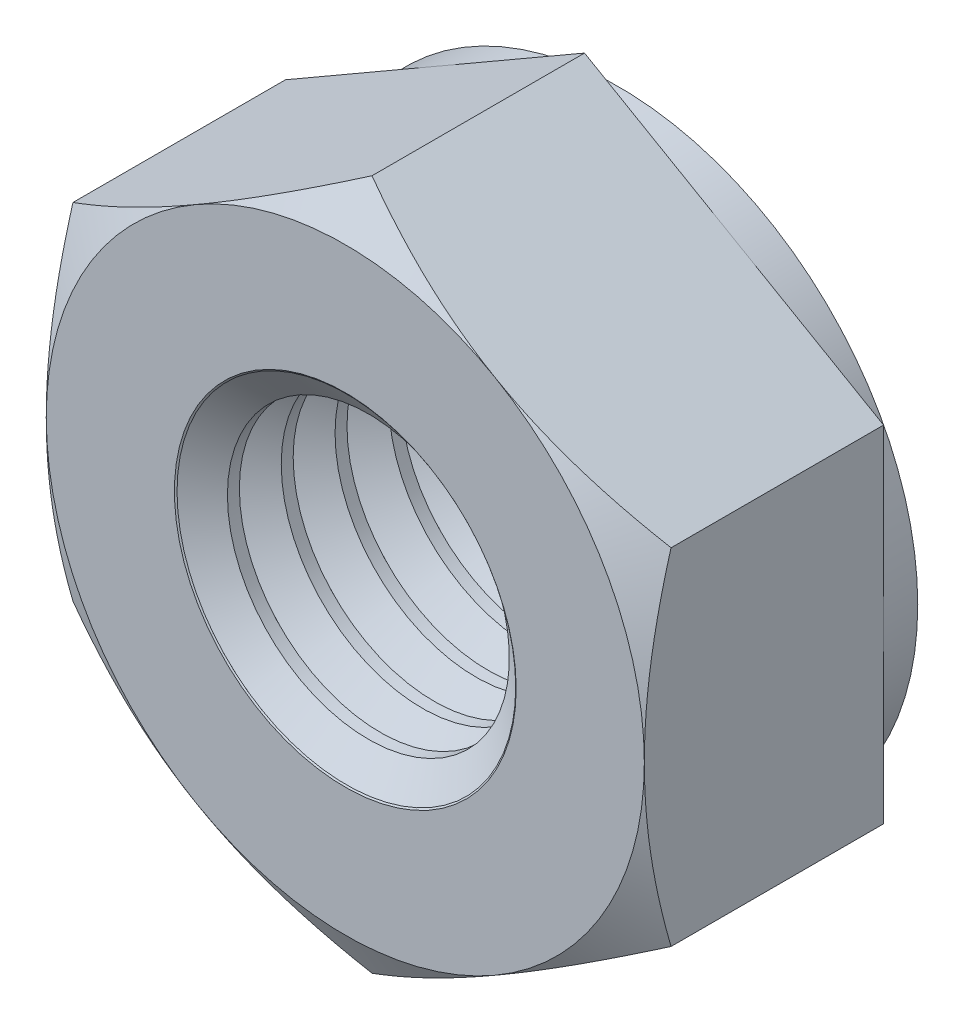
ISO-10303-21;
HEADER;
FILE_DESCRIPTION(('STEP AP214'),'2;1');
FILE_NAME('part.step','',(''),(''),'','','');
FILE_SCHEMA(('AUTOMOTIVE_DESIGN { 1 0 10303 214 1 1 1 1 }'));
ENDSEC;
DATA;
#1=APPLICATION_CONTEXT('core data for automotive mechanical design processes');
#2=APPLICATION_PROTOCOL_DEFINITION('international standard','automotive_design',2000,#1);
#3=PRODUCT_CONTEXT('',#1,'mechanical');
#4=PRODUCT('Part','Part','',(#3));
#5=PRODUCT_RELATED_PRODUCT_CATEGORY('part','',(#4));
#6=PRODUCT_DEFINITION_FORMATION('','',#4);
#7=PRODUCT_DEFINITION_CONTEXT('part definition',#1,'design');
#8=PRODUCT_DEFINITION('design','',#6,#7);
#9=PRODUCT_DEFINITION_SHAPE('','',#8);
#10=(LENGTH_UNIT() NAMED_UNIT(*) SI_UNIT(.MILLI.,.METRE.));
#11=(NAMED_UNIT(*) PLANE_ANGLE_UNIT() SI_UNIT($,.RADIAN.));
#12=(NAMED_UNIT(*) SI_UNIT($,.STERADIAN.) SOLID_ANGLE_UNIT());
#13=UNCERTAINTY_MEASURE_WITH_UNIT(LENGTH_MEASURE(1.E-05),#10,'distance_accuracy_value','');
#14=(GEOMETRIC_REPRESENTATION_CONTEXT(3) GLOBAL_UNCERTAINTY_ASSIGNED_CONTEXT((#13)) GLOBAL_UNIT_ASSIGNED_CONTEXT((#10,
#11,#12)) REPRESENTATION_CONTEXT('',''));
#15=CARTESIAN_POINT('',(0.,0.,0.));
#16=DIRECTION('',(0.,0.,1.));
#17=DIRECTION('',(1.,0.,0.));
#18=AXIS2_PLACEMENT_3D('',#15,#16,#17);
#19=CARTESIAN_POINT('',(0.,0.,-3.2));
#20=DIRECTION('',(0.,0.,1.));
#21=DIRECTION('',(1.,0.,0.));
#22=AXIS2_PLACEMENT_3D('',#19,#20,#21);
#23=CYLINDRICAL_SURFACE('',#22,1.65);
#24=CARTESIAN_POINT('',(0.,0.,-2.7898326383734));
#25=DIRECTION('',(0.,0.,-1.));
#26=DIRECTION('',(-1.,0.,0.));
#27=AXIS2_PLACEMENT_3D('',#24,#25,#26);
#28=CIRCLE('',#27,1.65);
#29=CARTESIAN_POINT('',(-1.65,0.,-2.7898326383734));
#30=VERTEX_POINT('',#29);
#31=EDGE_CURVE('E631',#30,#30,#28,.T.);
#32=ORIENTED_EDGE('',*,*,#31,.F.);
#33=EDGE_LOOP('',(#32));
#34=FACE_BOUND('',#33,.T.);
#35=CARTESIAN_POINT('',(0.,0.,-2.9295273616266));
#36=DIRECTION('',(0.,0.,-1.));
#37=DIRECTION('',(-1.,0.,0.));
#38=AXIS2_PLACEMENT_3D('',#35,#36,#37);
#39=CIRCLE('',#38,1.65);
#40=CARTESIAN_POINT('',(-1.65,0.,-2.9295273616266));
#41=VERTEX_POINT('',#40);
#42=EDGE_CURVE('E273',#41,#41,#39,.F.);
#43=ORIENTED_EDGE('',*,*,#42,.F.);
#44=EDGE_LOOP('',(#43));
#45=FACE_BOUND('',#44,.T.);
#46=ADVANCED_FACE('F36',(#34,#45),#23,.F.);
#47=CARTESIAN_POINT('',(0.,0.,-2.29968736162661));
#48=DIRECTION('',(0.,0.,-1.));
#49=DIRECTION('',(-1.,0.,0.));
#50=AXIS2_PLACEMENT_3D('',#47,#48,#49);
#51=CIRCLE('',#50,1.65);
#52=CARTESIAN_POINT('',(-1.65,0.,-2.29968736162661));
#53=VERTEX_POINT('',#52);
#54=EDGE_CURVE('E632',#53,#53,#51,.T.);
#55=ORIENTED_EDGE('',*,*,#54,.T.);
#56=EDGE_LOOP('',(#55));
#57=FACE_BOUND('',#56,.T.);
#58=CARTESIAN_POINT('',(0.,0.,-2.1599926383734));
#59=DIRECTION('',(0.,0.,-1.));
#60=DIRECTION('',(-1.,0.,0.));
#61=AXIS2_PLACEMENT_3D('',#58,#59,#60);
#62=CIRCLE('',#61,1.65);
#63=CARTESIAN_POINT('',(-1.65,0.,-2.1599926383734));
#64=VERTEX_POINT('',#63);
#65=EDGE_CURVE('E641',#64,#64,#62,.T.);
#66=ORIENTED_EDGE('',*,*,#65,.F.);
#67=EDGE_LOOP('',(#66));
#68=FACE_BOUND('',#67,.T.);
#69=ADVANCED_FACE('F228',(#57,#68),#23,.F.);
#70=CARTESIAN_POINT('',(0.,0.,-1.66984736162661));
#71=DIRECTION('',(0.,0.,-1.));
#72=DIRECTION('',(-1.,0.,0.));
#73=AXIS2_PLACEMENT_3D('',#70,#71,#72);
#74=CIRCLE('',#73,1.65);
#75=CARTESIAN_POINT('',(-1.65,0.,-1.66984736162661));
#76=VERTEX_POINT('',#75);
#77=EDGE_CURVE('E634',#76,#76,#74,.T.);
#78=ORIENTED_EDGE('',*,*,#77,.T.);
#79=EDGE_LOOP('',(#78));
#80=FACE_BOUND('',#79,.T.);
#81=CARTESIAN_POINT('',(0.,0.,-1.5301526383734));
#82=DIRECTION('',(0.,0.,-1.));
#83=DIRECTION('',(-1.,0.,0.));
#84=AXIS2_PLACEMENT_3D('',#81,#82,#83);
#85=CIRCLE('',#84,1.65);
#86=CARTESIAN_POINT('',(-1.65,0.,-1.5301526383734));
#87=VERTEX_POINT('',#86);
#88=EDGE_CURVE('E650',#87,#87,#85,.T.);
#89=ORIENTED_EDGE('',*,*,#88,.F.);
#90=EDGE_LOOP('',(#89));
#91=FACE_BOUND('',#90,.T.);
#92=ADVANCED_FACE('F235',(#80,#91),#23,.F.);
#93=CARTESIAN_POINT('',(0.,0.,-1.04000736162661));
#94=DIRECTION('',(0.,0.,-1.));
#95=DIRECTION('',(-1.,0.,0.));
#96=AXIS2_PLACEMENT_3D('',#93,#94,#95);
#97=CIRCLE('',#96,1.65);
#98=CARTESIAN_POINT('',(-1.65,0.,-1.04000736162661));
#99=VERTEX_POINT('',#98);
#100=EDGE_CURVE('E647',#99,#99,#97,.T.);
#101=ORIENTED_EDGE('',*,*,#100,.T.);
#102=EDGE_LOOP('',(#101));
#103=FACE_BOUND('',#102,.T.);
#104=CARTESIAN_POINT('',(0.,0.,-0.900312638373402));
#105=DIRECTION('',(0.,0.,-1.));
#106=DIRECTION('',(-1.,0.,0.));
#107=AXIS2_PLACEMENT_3D('',#104,#105,#106);
#108=CIRCLE('',#107,1.65);
#109=CARTESIAN_POINT('',(-1.65,0.,-0.900312638373402));
#110=VERTEX_POINT('',#109);
#111=EDGE_CURVE('E264',#110,#110,#108,.T.);
#112=ORIENTED_EDGE('',*,*,#111,.F.);
#113=EDGE_LOOP('',(#112));
#114=FACE_BOUND('',#113,.T.);
#115=ADVANCED_FACE('F241',(#103,#114),#23,.F.);
#116=CARTESIAN_POINT('',(0.,0.,-0.410167361626607));
#117=DIRECTION('',(0.,0.,-1.));
#118=DIRECTION('',(-1.,0.,0.));
#119=AXIS2_PLACEMENT_3D('',#116,#117,#118);
#120=CIRCLE('',#119,1.65);
#121=CARTESIAN_POINT('',(-1.65,0.,-0.410167361626607));
#122=VERTEX_POINT('',#121);
#123=EDGE_CURVE('E253',#122,#122,#120,.T.);
#124=ORIENTED_EDGE('',*,*,#123,.T.);
#125=EDGE_LOOP('',(#124));
#126=FACE_BOUND('',#125,.T.);
#127=CARTESIAN_POINT('',(0.,0.,-0.270472638373401));
#128=DIRECTION('',(0.,0.,-1.));
#129=DIRECTION('',(-1.,0.,0.));
#130=AXIS2_PLACEMENT_3D('',#127,#128,#129);
#131=CIRCLE('',#130,1.65);
#132=CARTESIAN_POINT('',(-1.65,0.,-0.270472638373401));
#133=VERTEX_POINT('',#132);
#134=EDGE_CURVE('E256',#133,#133,#131,.T.);
#135=ORIENTED_EDGE('',*,*,#134,.F.);
#136=EDGE_LOOP('',(#135));
#137=FACE_BOUND('',#136,.T.);
#138=ADVANCED_FACE('F231',(#126,#137),#23,.F.);
#139=CARTESIAN_POINT('',(0.,4.04145188432738,-3.2));
#140=DIRECTION('',(-0.5,0.866025403784438,0.));
#141=DIRECTION('',(-0.866025403784438,-0.5,0.));
#142=AXIS2_PLACEMENT_3D('',#139,#140,#141);
#143=PLANE('',#142);
#144=DIRECTION('',(0.,0.,1.));
#145=VECTOR('',#144,1.);
#146=CARTESIAN_POINT('',(-3.5,2.02072594216369,-3.2));
#147=LINE('',#146,#145);
#148=CARTESIAN_POINT('',(-3.5,2.02072594216369,-2.8));
#149=VERTEX_POINT('',#148);
#150=CARTESIAN_POINT('',(-3.5,2.02072594216369,-0.312607391169644));
#151=VERTEX_POINT('',#150);
#152=EDGE_CURVE('E290',#149,#151,#147,.T.);
#153=ORIENTED_EDGE('',*,*,#152,.T.);
#154=CARTESIAN_POINT('',(-3.5002,2.02061047210985,-0.312674060693372));
#155=CARTESIAN_POINT('',(-3.34639282154755,2.10941108799267,-0.261385788989984));
#156=CARTESIAN_POINT('',(-3.19125798916558,2.19897822522909,-0.214740953816197));
#157=CARTESIAN_POINT('',(-2.87830199342322,2.37966345361545,-0.133321875533348));
#158=CARTESIAN_POINT('',(-2.7204752692125,2.47078475532382,-0.0985764355845612));
#159=CARTESIAN_POINT('',(-2.40677778961987,2.65189807961073,-0.0444900271828358));
#160=CARTESIAN_POINT('',(-2.25095530083931,2.74186223545399,-0.0247890862603812));
#161=CARTESIAN_POINT('',(-1.93857711279463,2.92221386641056,-0.0012701327372539));
#162=CARTESIAN_POINT('',(-1.78202254896577,3.01260068598001,0.00256735545443528));
#163=CARTESIAN_POINT('',(-1.48949078007901,3.1814939814933,-0.00541530187697733));
#164=CARTESIAN_POINT('',(-1.35346978754209,3.26002573814993,-0.0152754340696069));
#165=CARTESIAN_POINT('',(-1.082313979711,3.41657761679354,-0.0465264668994037));
#166=CARTESIAN_POINT('',(-0.947180102315317,3.49459719728458,-0.0679280432857986));
#167=CARTESIAN_POINT('',(-0.675465207594816,3.65147186489429,-0.121430407880578));
#168=CARTESIAN_POINT('',(-0.538918580721664,3.73030709667644,-0.153757994445087));
#169=CARTESIAN_POINT('',(-0.267861907055498,3.88680174018324,-0.227128933807995));
#170=CARTESIAN_POINT('',(-0.133348387531463,3.96446315689009,-0.268155046569868));
#171=CARTESIAN_POINT('',(0.000200000000000051,4.04156735438122,-0.312674060693372));
#172=B_SPLINE_CURVE_WITH_KNOTS('',3,(#154,#155,#156,#157,#158,#159,#160,#161,#162,#163,#164,
#165,#166,#167,#168,#169,#170,#171),.UNSPECIFIED.,.F.,.F.,(4,2,2,2,2,2,2,2,4),(0.,
0.554793832886254,1.11092123814984,1.65328467083219,2.19498204478403,2.6666513085086,
3.13875761298267,3.6213361260051,4.10296698719187),.UNSPECIFIED.);
#173=CARTESIAN_POINT('',(-1.75,3.03108891324554,0.));
#174=VERTEX_POINT('',#173);
#175=EDGE_CURVE('E139',#151,#174,#172,.T.);
#176=ORIENTED_EDGE('',*,*,#175,.T.);
#177=CARTESIAN_POINT('',(0.,4.04145188432738,-0.312607391169644));
#178=VERTEX_POINT('',#177);
#179=EDGE_CURVE('E166',#174,#178,#172,.T.);
#180=ORIENTED_EDGE('',*,*,#179,.T.);
#181=DIRECTION('',(0.,0.,1.));
#182=VECTOR('',#181,1.);
#183=CARTESIAN_POINT('',(0.,4.04145188432738,-3.2));
#184=LINE('',#183,#182);
#185=CARTESIAN_POINT('',(0.,4.04145188432738,-2.8));
#186=VERTEX_POINT('',#185);
#187=EDGE_CURVE('E289',#186,#178,#184,.T.);
#188=ORIENTED_EDGE('',*,*,#187,.F.);
#189=DIRECTION('',(-0.866025403784438,-0.5,0.));
#190=VECTOR('',#189,1.);
#191=CARTESIAN_POINT('',(0.,4.04145188432738,-2.8));
#192=LINE('',#191,#190);
#193=CARTESIAN_POINT('',(-1.75,3.03108891324554,-2.8));
#194=VERTEX_POINT('',#193);
#195=EDGE_CURVE('E318',#186,#194,#192,.T.);
#196=ORIENTED_EDGE('',*,*,#195,.T.);
#197=EDGE_CURVE('E315',#194,#149,#192,.T.);
#198=ORIENTED_EDGE('',*,*,#197,.T.);
#199=EDGE_LOOP('',(#153,#176,#180,#188,#196,#198));
#200=FACE_BOUND('',#199,.T.);
#201=ADVANCED_FACE('F38',(#200),#143,.T.);
#202=CARTESIAN_POINT('',(3.5,2.02072594216369,-3.2));
#203=DIRECTION('',(0.5,0.866025403784438,0.));
#204=DIRECTION('',(-0.866025403784438,0.5,0.));
#205=AXIS2_PLACEMENT_3D('',#202,#203,#204);
#206=PLANE('',#205);
#207=ORIENTED_EDGE('',*,*,#187,.T.);
#208=CARTESIAN_POINT('',(-0.000199999999999658,4.04156735438122,-0.312674060693372));
#209=CARTESIAN_POINT('',(0.15360717845245,3.9527667384984,-0.261385788989984));
#210=CARTESIAN_POINT('',(0.308742010834424,3.86319960126198,-0.214740953816198));
#211=CARTESIAN_POINT('',(0.621698006576782,3.68251437287562,-0.133321875533349));
#212=CARTESIAN_POINT('',(0.779524730787497,3.59139307116725,-0.0985764355845616));
#213=CARTESIAN_POINT('',(1.09322221038013,3.41027974688034,-0.0444900271828358));
#214=CARTESIAN_POINT('',(1.24904469916069,3.32031559103708,-0.0247890862603809));
#215=CARTESIAN_POINT('',(1.56142288720538,3.13996396008051,-0.00127013273725367));
#216=CARTESIAN_POINT('',(1.71797745103423,3.04957714051106,0.00256735545443519));
#217=CARTESIAN_POINT('',(2.01050921992099,2.88068384499777,-0.00541530187697748));
#218=CARTESIAN_POINT('',(2.14653021245791,2.80215208834114,-0.0152754340696069));
#219=CARTESIAN_POINT('',(2.417686020289,2.64560020969753,-0.0465264668994032));
#220=CARTESIAN_POINT('',(2.55281989768468,2.56758062920649,-0.0679280432857978));
#221=CARTESIAN_POINT('',(2.82453479240518,2.41070596159678,-0.121430407880577));
#222=CARTESIAN_POINT('',(2.96108141927834,2.33187072981463,-0.153757994445087));
#223=CARTESIAN_POINT('',(3.2321380929445,2.17537608630783,-0.227128933807994));
#224=CARTESIAN_POINT('',(3.36665161246854,2.09771466960098,-0.268155046569867));
#225=CARTESIAN_POINT('',(3.5002,2.02061047210985,-0.312674060693371));
#226=B_SPLINE_CURVE_WITH_KNOTS('',3,(#208,#209,#210,#211,#212,#213,#214,#215,#216,#217,#218,
#219,#220,#221,#222,#223,#224,#225),.UNSPECIFIED.,.F.,.F.,(4,2,2,2,2,2,2,2,4),(0.,
0.554793832886254,1.11092123814984,1.65328467083219,2.19498204478403,2.6666513085086,
3.13875761298267,3.6213361260051,4.10296698719187),.UNSPECIFIED.);
#227=CARTESIAN_POINT('',(1.75,3.03108891324553,0.));
#228=VERTEX_POINT('',#227);
#229=EDGE_CURVE('E162',#178,#228,#226,.T.);
#230=ORIENTED_EDGE('',*,*,#229,.T.);
#231=CARTESIAN_POINT('',(3.5,2.02072594216369,-0.312607391169644));
#232=VERTEX_POINT('',#231);
#233=EDGE_CURVE('E148',#228,#232,#226,.T.);
#234=ORIENTED_EDGE('',*,*,#233,.T.);
#235=DIRECTION('',(0.,0.,1.));
#236=VECTOR('',#235,1.);
#237=CARTESIAN_POINT('',(3.5,2.02072594216369,-3.2));
#238=LINE('',#237,#236);
#239=CARTESIAN_POINT('',(3.5,2.02072594216369,-2.8));
#240=VERTEX_POINT('',#239);
#241=EDGE_CURVE('E161',#240,#232,#238,.T.);
#242=ORIENTED_EDGE('',*,*,#241,.F.);
#243=DIRECTION('',(-0.866025403784438,0.5,0.));
#244=VECTOR('',#243,1.);
#245=CARTESIAN_POINT('',(3.5,2.02072594216369,-2.8));
#246=LINE('',#245,#244);
#247=CARTESIAN_POINT('',(1.75,3.03108891324553,-2.8));
#248=VERTEX_POINT('',#247);
#249=EDGE_CURVE('E310',#240,#248,#246,.T.);
#250=ORIENTED_EDGE('',*,*,#249,.T.);
#251=EDGE_CURVE('E307',#248,#186,#246,.T.);
#252=ORIENTED_EDGE('',*,*,#251,.T.);
#253=EDGE_LOOP('',(#207,#230,#234,#242,#250,#252));
#254=FACE_BOUND('',#253,.T.);
#255=ADVANCED_FACE('F247',(#254),#206,.T.);
#256=CARTESIAN_POINT('',(3.5,2.02072594216369,-3.2));
#257=DIRECTION('',(-1.,0.,0.));
#258=DIRECTION('',(0.,0.,1.));
#259=AXIS2_PLACEMENT_3D('',#256,#257,#258);
#260=PLANE('',#259);
#261=CARTESIAN_POINT('',(3.5,-5.35926299121405,-1.67484346858556));
#262=CARTESIAN_POINT('',(3.5,-5.20559319908842,-1.60058173692104));
#263=CARTESIAN_POINT('',(3.5,-5.05156008083375,-1.52705822833147));
#264=CARTESIAN_POINT('',(3.5,-4.7425707418071,-1.38190950344752));
#265=CARTESIAN_POINT('',(3.5,-4.58761436682436,-1.31028461582133));
#266=CARTESIAN_POINT('',(3.5,-4.27574500225542,-1.16897765517624));
#267=CARTESIAN_POINT('',(3.5,-4.11882589028192,-1.09930904568016));
#268=CARTESIAN_POINT('',(3.5,-3.80369792903855,-0.962964262242759));
#269=CARTESIAN_POINT('',(3.5,-3.64548914750595,-0.896287932319517));
#270=CARTESIAN_POINT('',(3.5,-3.32556618401855,-0.765931819095066));
#271=CARTESIAN_POINT('',(3.5,-3.16383281219923,-0.702298873688864));
#272=CARTESIAN_POINT('',(3.5,-2.83845840945597,-0.580016702089492));
#273=CARTESIAN_POINT('',(3.5,-2.67481716858826,-0.52136803037069));
#274=CARTESIAN_POINT('',(3.5,-2.34570278472049,-0.410630279877021));
#275=CARTESIAN_POINT('',(3.5,-2.18023438248742,-0.358527255435857));
#276=CARTESIAN_POINT('',(3.5,-1.84694522806369,-0.262572936976443));
#277=CARTESIAN_POINT('',(3.5,-1.6791252378753,-0.218719033467157));
#278=CARTESIAN_POINT('',(3.5,-1.34101828610925,-0.141391945584786));
#279=CARTESIAN_POINT('',(3.5,-1.17073068027693,-0.107921525211972));
#280=CARTESIAN_POINT('',(3.5,-0.828102385138483,-0.0536149564320502));
#281=CARTESIAN_POINT('',(3.5,-0.6557616940173,-0.0327788191952362));
#282=CARTESIAN_POINT('',(3.5,-0.311020490924448,-0.00558408650575642));
#283=CARTESIAN_POINT('',(3.5,-0.138627397207259,0.000866163165911387));
#284=CARTESIAN_POINT('',(3.5,0.206038074906536,-0.00105355807794622));
#285=CARTESIAN_POINT('',(3.5,0.37831047302318,-0.0094196819634321));
#286=CARTESIAN_POINT('',(3.5,0.672490555822328,-0.035768892786892));
#287=CARTESIAN_POINT('',(3.5,0.794722791084093,-0.0503206340384211));
#288=CARTESIAN_POINT('',(3.5,1.0382430543056,-0.0859367340533555));
#289=CARTESIAN_POINT('',(3.5,1.15953093025887,-0.107002119926141));
#290=CARTESIAN_POINT('',(3.5,1.52187914771348,-0.178863187081453));
#291=CARTESIAN_POINT('',(3.5,1.76124104212632,-0.23830527562201));
#292=CARTESIAN_POINT('',(3.5,2.11940971387708,-0.340826814402554));
#293=CARTESIAN_POINT('',(3.5,2.24008344316346,-0.377749699085183));
#294=CARTESIAN_POINT('',(3.5,2.48017139213728,-0.455249007699294));
#295=CARTESIAN_POINT('',(3.5,2.59958641795613,-0.49582291166355));
#296=CARTESIAN_POINT('',(3.5,2.83665760451798,-0.579779986782752));
#297=CARTESIAN_POINT('',(3.5,2.95431988203483,-0.623146060034314));
#298=CARTESIAN_POINT('',(3.5,3.188731535088,-0.712423559566866));
#299=CARTESIAN_POINT('',(3.5,3.30548051959464,-0.75833601459295));
#300=CARTESIAN_POINT('',(3.5,3.42180736613349,-0.80527038072407));
#301=B_SPLINE_CURVE_WITH_KNOTS('',3,(#261,#262,#263,#264,#265,#266,#267,#268,#269,#270,#271,
#272,#273,#274,#275,#276,#277,#278,#279,#280,#281,#282,#283,#284,#285,#286,#287,#288,#289,#290,
#291,#292,#293,#294,#295,#296,#297,#298,#299,#300),.UNSPECIFIED.,.F.,.F.,(4,2,2,2,2,2,2,2,2,2,2,
2,2,2,2,2,2,2,2,4),(0.,0.512025318465737,1.02413870177436,1.53918270315241,2.05419982499224,
2.57553975872798,3.09693761309353,3.617205066104,4.13730766217537,4.65754858684364,
5.17778997146961,5.69470725122282,6.211490334524,6.58059623222331,6.94976036239484,
7.68863804939851,8.06719621660478,8.4454950747676,8.82166461280099,9.1979872473341),.UNSPECIFIED.);
#302=CARTESIAN_POINT('',(3.5,-2.02072594216369,-0.312607391169644));
#303=VERTEX_POINT('',#302);
#304=CARTESIAN_POINT('',(3.5,0.,0.));
#305=VERTEX_POINT('',#304);
#306=EDGE_CURVE('E128',#303,#305,#301,.T.);
#307=ORIENTED_EDGE('',*,*,#306,.F.);
#308=DIRECTION('',(0.,0.,1.));
#309=VECTOR('',#308,1.);
#310=CARTESIAN_POINT('',(3.5,-2.02072594216369,-3.2));
#311=LINE('',#310,#309);
#312=CARTESIAN_POINT('',(3.5,-2.02072594216369,-2.8));
#313=VERTEX_POINT('',#312);
#314=EDGE_CURVE('E299',#313,#303,#311,.T.);
#315=ORIENTED_EDGE('',*,*,#314,.F.);
#316=DIRECTION('',(0.,-1.,0.));
#317=VECTOR('',#316,1.);
#318=CARTESIAN_POINT('',(3.5,2.02072594216369,-2.8));
#319=LINE('',#318,#317);
#320=CARTESIAN_POINT('',(3.5,0.,-2.8));
#321=VERTEX_POINT('',#320);
#322=EDGE_CURVE('E304',#321,#313,#319,.T.);
#323=ORIENTED_EDGE('',*,*,#322,.F.);
#324=EDGE_CURVE('E294',#240,#321,#319,.T.);
#325=ORIENTED_EDGE('',*,*,#324,.F.);
#326=ORIENTED_EDGE('',*,*,#241,.T.);
#327=EDGE_CURVE('E141',#305,#232,#301,.T.);
#328=ORIENTED_EDGE('',*,*,#327,.F.);
#329=EDGE_LOOP('',(#307,#315,#323,#325,#326,#328));
#330=FACE_BOUND('',#329,.T.);
#331=ADVANCED_FACE('F158',(#330),#260,.F.);
#332=CARTESIAN_POINT('',(0.,-4.04145188432739,-3.2));
#333=DIRECTION('',(0.5,-0.866025403784438,0.));
#334=DIRECTION('',(0.866025403784438,0.5,0.));
#335=AXIS2_PLACEMENT_3D('',#332,#333,#334);
#336=PLANE('',#335);
#337=ORIENTED_EDGE('',*,*,#314,.T.);
#338=CARTESIAN_POINT('',(3.5002,-2.02061047210986,-0.312674060693373));
#339=CARTESIAN_POINT('',(3.34639282154755,-2.10941108799267,-0.261385788989985));
#340=CARTESIAN_POINT('',(3.19125798916558,-2.19897822522909,-0.214740953816198));
#341=CARTESIAN_POINT('',(2.87830199342322,-2.37966345361545,-0.13332187553335));
#342=CARTESIAN_POINT('',(2.7204752692125,-2.47078475532382,-0.0985764355845621));
#343=CARTESIAN_POINT('',(2.40677778961987,-2.65189807961074,-0.0444900271828368));
#344=CARTESIAN_POINT('',(2.25095530083931,-2.741862235454,-0.0247890862603824));
#345=CARTESIAN_POINT('',(1.93857711279462,-2.92221386641056,-0.00127013273725543));
#346=CARTESIAN_POINT('',(1.78202254896577,-3.01260068598001,0.00256735545443363));
#347=CARTESIAN_POINT('',(1.48949078007901,-3.1814939814933,-0.00541530187697916));
#348=CARTESIAN_POINT('',(1.35346978754209,-3.26002573814993,-0.0152754340696088));
#349=CARTESIAN_POINT('',(1.082313979711,-3.41657761679354,-0.0465264668994056));
#350=CARTESIAN_POINT('',(0.947180102315316,-3.49459719728458,-0.0679280432858005));
#351=CARTESIAN_POINT('',(0.675465207594815,-3.65147186489429,-0.12143040788058));
#352=CARTESIAN_POINT('',(0.538918580721664,-3.73030709667644,-0.15375799444509));
#353=CARTESIAN_POINT('',(0.267861907055498,-3.88680174018325,-0.227128933807997));
#354=CARTESIAN_POINT('',(0.133348387531463,-3.96446315689009,-0.26815504656987));
#355=CARTESIAN_POINT('',(-0.000200000000000231,-4.04156735438122,-0.312674060693374));
#356=B_SPLINE_CURVE_WITH_KNOTS('',3,(#338,#339,#340,#341,#342,#343,#344,#345,#346,#347,#348,
#349,#350,#351,#352,#353,#354,#355),.UNSPECIFIED.,.F.,.F.,(4,2,2,2,2,2,2,2,4),(0.,
0.554793832886255,1.11092123814984,1.65328467083219,2.19498204478403,2.6666513085086,
3.13875761298267,3.6213361260051,4.10296698719187),.UNSPECIFIED.);
#357=CARTESIAN_POINT('',(1.75,-3.03108891324553,0.));
#358=VERTEX_POINT('',#357);
#359=EDGE_CURVE('E134',#303,#358,#356,.T.);
#360=ORIENTED_EDGE('',*,*,#359,.T.);
#361=CARTESIAN_POINT('',(0.,-4.04145188432738,-0.312607391169644));
#362=VERTEX_POINT('',#361);
#363=EDGE_CURVE('E55',#358,#362,#356,.T.);
#364=ORIENTED_EDGE('',*,*,#363,.T.);
#365=DIRECTION('',(0.,0.,1.));
#366=VECTOR('',#365,1.);
#367=CARTESIAN_POINT('',(0.,-4.04145188432739,-3.2));
#368=LINE('',#367,#366);
#369=CARTESIAN_POINT('',(0.,-4.04145188432739,-2.8));
#370=VERTEX_POINT('',#369);
#371=EDGE_CURVE('E296',#370,#362,#368,.T.);
#372=ORIENTED_EDGE('',*,*,#371,.F.);
#373=DIRECTION('',(0.866025403784438,0.5,0.));
#374=VECTOR('',#373,1.);
#375=CARTESIAN_POINT('',(0.,-4.04145188432739,-2.8));
#376=LINE('',#375,#374);
#377=CARTESIAN_POINT('',(1.75,-3.03108891324554,-2.8));
#378=VERTEX_POINT('',#377);
#379=EDGE_CURVE('E311',#370,#378,#376,.T.);
#380=ORIENTED_EDGE('',*,*,#379,.T.);
#381=EDGE_CURVE('E306',#378,#313,#376,.T.);
#382=ORIENTED_EDGE('',*,*,#381,.T.);
#383=EDGE_LOOP('',(#337,#360,#364,#372,#380,#382));
#384=FACE_BOUND('',#383,.T.);
#385=ADVANCED_FACE('F214',(#384),#336,.T.);
#386=CARTESIAN_POINT('',(-3.5,-2.02072594216369,-3.2));
#387=DIRECTION('',(-0.500000000000001,-0.866025403784438,0.));
#388=DIRECTION('',(0.866025403784438,-0.500000000000001,0.));
#389=AXIS2_PLACEMENT_3D('',#386,#387,#388);
#390=PLANE('',#389);
#391=ORIENTED_EDGE('',*,*,#371,.T.);
#392=CARTESIAN_POINT('',(0.000199999999999979,-4.04156735438122,-0.312674060693374));
#393=CARTESIAN_POINT('',(-0.15360717845245,-3.9527667384984,-0.261385788989986));
#394=CARTESIAN_POINT('',(-0.308742010834424,-3.86319960126198,-0.2147409538162));
#395=CARTESIAN_POINT('',(-0.621698006576782,-3.68251437287563,-0.133321875533351));
#396=CARTESIAN_POINT('',(-0.779524730787497,-3.59139307116725,-0.0985764355845635));
#397=CARTESIAN_POINT('',(-1.09322221038013,-3.41027974688034,-0.0444900271828377));
#398=CARTESIAN_POINT('',(-1.24904469916069,-3.32031559103708,-0.0247890862603829));
#399=CARTESIAN_POINT('',(-1.56142288720538,-3.13996396008052,-0.00127013273725543));
#400=CARTESIAN_POINT('',(-1.71797745103423,-3.04957714051106,0.00256735545443375));
#401=CARTESIAN_POINT('',(-2.01050921992099,-2.88068384499777,-0.00541530187697879));
#402=CARTESIAN_POINT('',(-2.14653021245791,-2.80215208834115,-0.0152754340696083));
#403=CARTESIAN_POINT('',(-2.417686020289,-2.64560020969754,-0.0465264668994048));
#404=CARTESIAN_POINT('',(-2.55281989768468,-2.5675806292065,-0.0679280432857996));
#405=CARTESIAN_POINT('',(-2.82453479240519,-2.41070596159679,-0.121430407880578));
#406=CARTESIAN_POINT('',(-2.96108141927834,-2.33187072981464,-0.153757994445088));
#407=CARTESIAN_POINT('',(-3.2321380929445,-2.17537608630783,-0.227128933807995));
#408=CARTESIAN_POINT('',(-3.36665161246854,-2.09771466960098,-0.268155046569868));
#409=CARTESIAN_POINT('',(-3.5002,-2.02061047210985,-0.312674060693372));
#410=B_SPLINE_CURVE_WITH_KNOTS('',3,(#392,#393,#394,#395,#396,#397,#398,#399,#400,#401,#402,
#403,#404,#405,#406,#407,#408,#409),.UNSPECIFIED.,.F.,.F.,(4,2,2,2,2,2,2,2,4),(0.,
0.554793832886255,1.11092123814984,1.65328467083219,2.19498204478403,2.6666513085086,
3.13875761298268,3.6213361260051,4.10296698719187),.UNSPECIFIED.);
#411=CARTESIAN_POINT('',(-1.75,-3.03108891324553,0.));
#412=VERTEX_POINT('',#411);
#413=EDGE_CURVE('E208',#362,#412,#410,.T.);
#414=ORIENTED_EDGE('',*,*,#413,.T.);
#415=CARTESIAN_POINT('',(-3.5,-2.02072594216369,-0.312607391169644));
#416=VERTEX_POINT('',#415);
#417=EDGE_CURVE('E62',#412,#416,#410,.T.);
#418=ORIENTED_EDGE('',*,*,#417,.T.);
#419=DIRECTION('',(0.,0.,1.));
#420=VECTOR('',#419,1.);
#421=CARTESIAN_POINT('',(-3.5,-2.02072594216369,-3.2));
#422=LINE('',#421,#420);
#423=CARTESIAN_POINT('',(-3.5,-2.02072594216369,-2.8));
#424=VERTEX_POINT('',#423);
#425=EDGE_CURVE('E293',#424,#416,#422,.T.);
#426=ORIENTED_EDGE('',*,*,#425,.F.);
#427=DIRECTION('',(0.866025403784438,-0.500000000000001,0.));
#428=VECTOR('',#427,1.);
#429=CARTESIAN_POINT('',(-3.5,-2.02072594216369,-2.8));
#430=LINE('',#429,#428);
#431=CARTESIAN_POINT('',(-1.75,-3.03108891324554,-2.8));
#432=VERTEX_POINT('',#431);
#433=EDGE_CURVE('E319',#424,#432,#430,.T.);
#434=ORIENTED_EDGE('',*,*,#433,.T.);
#435=EDGE_CURVE('E314',#432,#370,#430,.T.);
#436=ORIENTED_EDGE('',*,*,#435,.T.);
#437=EDGE_LOOP('',(#391,#414,#418,#426,#434,#436));
#438=FACE_BOUND('',#437,.T.);
#439=ADVANCED_FACE('F210',(#438),#390,.T.);
#440=CARTESIAN_POINT('',(-3.5,2.02072594216369,-3.2));
#441=DIRECTION('',(-1.,0.,0.));
#442=DIRECTION('',(0.,0.,1.));
#443=AXIS2_PLACEMENT_3D('',#440,#441,#442);
#444=PLANE('',#443);
#445=ORIENTED_EDGE('',*,*,#425,.T.);
#446=CARTESIAN_POINT('',(-3.5,-5.35926299121405,-1.67484346858556));
#447=CARTESIAN_POINT('',(-3.5,-5.20559319908842,-1.60058173692104));
#448=CARTESIAN_POINT('',(-3.5,-5.05156008083375,-1.52705822833147));
#449=CARTESIAN_POINT('',(-3.5,-4.7425707418071,-1.38190950344752));
#450=CARTESIAN_POINT('',(-3.5,-4.58761436682436,-1.31028461582133));
#451=CARTESIAN_POINT('',(-3.5,-4.27574500225542,-1.16897765517624));
#452=CARTESIAN_POINT('',(-3.5,-4.11882589028192,-1.09930904568016));
#453=CARTESIAN_POINT('',(-3.5,-3.80369792903855,-0.96296426224276));
#454=CARTESIAN_POINT('',(-3.5,-3.64548914750595,-0.896287932319518));
#455=CARTESIAN_POINT('',(-3.5,-3.32556618401855,-0.765931819095067));
#456=CARTESIAN_POINT('',(-3.5,-3.16383281219924,-0.702298873688865));
#457=CARTESIAN_POINT('',(-3.5,-2.83845840945597,-0.580016702089492));
#458=CARTESIAN_POINT('',(-3.5,-2.67481716858826,-0.521368030370691));
#459=CARTESIAN_POINT('',(-3.5,-2.34570278472049,-0.410630279877021));
#460=CARTESIAN_POINT('',(-3.5,-2.18023438248742,-0.358527255435857));
#461=CARTESIAN_POINT('',(-3.5,-1.84694522806369,-0.262572936976443));
#462=CARTESIAN_POINT('',(-3.5,-1.6791252378753,-0.218719033467157));
#463=CARTESIAN_POINT('',(-3.5,-1.34101828610925,-0.141391945584786));
#464=CARTESIAN_POINT('',(-3.5,-1.17073068027693,-0.107921525211972));
#465=CARTESIAN_POINT('',(-3.5,-0.828102385138482,-0.05361495643205));
#466=CARTESIAN_POINT('',(-3.5,-0.6557616940173,-0.0327788191952361));
#467=CARTESIAN_POINT('',(-3.5,-0.311020490924448,-0.00558408650575648));
#468=CARTESIAN_POINT('',(-3.5,-0.138627397207258,0.000866163165911363));
#469=CARTESIAN_POINT('',(-3.5,0.206038074906536,-0.0010535580779462));
#470=CARTESIAN_POINT('',(-3.5,0.37831047302318,-0.00941968196343206));
#471=CARTESIAN_POINT('',(-3.5,0.672490555822328,-0.035768892786892));
#472=CARTESIAN_POINT('',(-3.5,0.794722791084093,-0.0503206340384212));
#473=CARTESIAN_POINT('',(-3.5,1.0382430543056,-0.0859367340533555));
#474=CARTESIAN_POINT('',(-3.5,1.15953093025887,-0.107002119926141));
#475=CARTESIAN_POINT('',(-3.5,1.52187914771348,-0.178863187081453));
#476=CARTESIAN_POINT('',(-3.5,1.76124104212632,-0.238305275622009));
#477=CARTESIAN_POINT('',(-3.5,2.11940971387708,-0.340826814402554));
#478=CARTESIAN_POINT('',(-3.5,2.24008344316346,-0.377749699085183));
#479=CARTESIAN_POINT('',(-3.5,2.48017139213728,-0.455249007699294));
#480=CARTESIAN_POINT('',(-3.5,2.59958641795613,-0.495822911663549));
#481=CARTESIAN_POINT('',(-3.5,2.83665760451798,-0.579779986782752));
#482=CARTESIAN_POINT('',(-3.5,2.95431988203483,-0.623146060034314));
#483=CARTESIAN_POINT('',(-3.5,3.188731535088,-0.712423559566866));
#484=CARTESIAN_POINT('',(-3.5,3.30548051959464,-0.75833601459295));
#485=CARTESIAN_POINT('',(-3.5,3.42180736613349,-0.805270380724071));
#486=B_SPLINE_CURVE_WITH_KNOTS('',3,(#446,#447,#448,#449,#450,#451,#452,#453,#454,#455,#456,
#457,#458,#459,#460,#461,#462,#463,#464,#465,#466,#467,#468,#469,#470,#471,#472,#473,#474,#475,
#476,#477,#478,#479,#480,#481,#482,#483,#484,#485),.UNSPECIFIED.,.F.,.F.,(4,2,2,2,2,2,2,2,2,2,2,
2,2,2,2,2,2,2,2,4),(0.,0.512025318465737,1.02413870177436,1.53918270315241,2.05419982499223,
2.57553975872798,3.09693761309353,3.617205066104,4.13730766217537,4.65754858684365,
5.17778997146961,5.69470725122282,6.21149033452401,6.58059623222331,6.94976036239485,
7.68863804939851,8.06719621660478,8.4454950747676,8.82166461280099,9.19798724733411),.UNSPECIFIED.);
#487=CARTESIAN_POINT('',(-3.5,0.,0.));
#488=VERTEX_POINT('',#487);
#489=EDGE_CURVE('E209',#416,#488,#486,.T.);
#490=ORIENTED_EDGE('',*,*,#489,.T.);
#491=EDGE_CURVE('E152',#488,#151,#486,.T.);
#492=ORIENTED_EDGE('',*,*,#491,.T.);
#493=ORIENTED_EDGE('',*,*,#152,.F.);
#494=DIRECTION('',(0.,-1.,0.));
#495=VECTOR('',#494,1.);
#496=CARTESIAN_POINT('',(-3.5,2.02072594216369,-2.8));
#497=LINE('',#496,#495);
#498=CARTESIAN_POINT('',(-3.5,0.,-2.8));
#499=VERTEX_POINT('',#498);
#500=EDGE_CURVE('E285',#149,#499,#497,.T.);
#501=ORIENTED_EDGE('',*,*,#500,.T.);
#502=EDGE_CURVE('E282',#499,#424,#497,.T.);
#503=ORIENTED_EDGE('',*,*,#502,.T.);
#504=EDGE_LOOP('',(#445,#490,#492,#493,#501,#503));
#505=FACE_BOUND('',#504,.T.);
#506=ADVANCED_FACE('F213',(#505),#444,.T.);
#507=CARTESIAN_POINT('',(-7.,0.,0.));
#508=DIRECTION('',(0.,0.,1.));
#509=DIRECTION('',(1.,0.,0.));
#510=AXIS2_PLACEMENT_3D('',#507,#508,#509);
#511=PLANE('',#510);
#512=CARTESIAN_POINT('',(0.,0.,0.));
#513=DIRECTION('',(0.,0.,1.));
#514=DIRECTION('',(1.,0.,0.));
#515=AXIS2_PLACEMENT_3D('',#512,#513,#514);
#516=CIRCLE('',#515,2.);
#517=CARTESIAN_POINT('',(2.,0.,0.));
#518=VERTEX_POINT('',#517);
#519=EDGE_CURVE('E153',#518,#518,#516,.T.);
#520=ORIENTED_EDGE('',*,*,#519,.F.);
#521=EDGE_LOOP('',(#520));
#522=FACE_BOUND('',#521,.T.);
#523=CARTESIAN_POINT('',(0.,0.,0.));
#524=DIRECTION('',(0.,0.,1.));
#525=DIRECTION('',(1.,0.,0.));
#526=AXIS2_PLACEMENT_3D('',#523,#524,#525);
#527=CIRCLE('',#526,3.5);
#528=EDGE_CURVE('E12',#305,#358,#527,.F.);
#529=ORIENTED_EDGE('',*,*,#528,.F.);
#530=CARTESIAN_POINT('',(0.,0.,0.));
#531=DIRECTION('',(0.,0.,1.));
#532=DIRECTION('',(1.,0.,0.));
#533=AXIS2_PLACEMENT_3D('',#530,#531,#532);
#534=CIRCLE('',#533,3.5);
#535=EDGE_CURVE('E145',#305,#228,#534,.T.);
#536=ORIENTED_EDGE('',*,*,#535,.T.);
#537=EDGE_CURVE('E48',#174,#228,#527,.F.);
#538=ORIENTED_EDGE('',*,*,#537,.F.);
#539=EDGE_CURVE('E374',#488,#174,#527,.F.);
#540=ORIENTED_EDGE('',*,*,#539,.F.);
#541=EDGE_CURVE('E375',#412,#488,#527,.F.);
#542=ORIENTED_EDGE('',*,*,#541,.F.);
#543=EDGE_CURVE('E46',#358,#412,#527,.F.);
#544=ORIENTED_EDGE('',*,*,#543,.F.);
#545=EDGE_LOOP('',(#529,#536,#538,#540,#542,#544));
#546=FACE_BOUND('',#545,.T.);
#547=ADVANCED_FACE('F155',(#522,#546),#511,.T.);
#548=CARTESIAN_POINT('',(-7.,0.,-3.2));
#549=DIRECTION('',(0.,0.,1.));
#550=DIRECTION('',(1.,0.,0.));
#551=AXIS2_PLACEMENT_3D('',#548,#549,#550);
#552=PLANE('',#551);
#553=CARTESIAN_POINT('',(0.,0.,-3.2));
#554=DIRECTION('',(0.,0.,1.));
#555=DIRECTION('',(1.,0.,0.));
#556=AXIS2_PLACEMENT_3D('',#553,#554,#555);
#557=CIRCLE('',#556,2.);
#558=CARTESIAN_POINT('',(2.,0.,-3.2));
#559=VERTEX_POINT('',#558);
#560=EDGE_CURVE('E271',#559,#559,#557,.F.);
#561=ORIENTED_EDGE('',*,*,#560,.F.);
#562=EDGE_LOOP('',(#561));
#563=FACE_BOUND('',#562,.T.);
#564=CARTESIAN_POINT('',(0.,0.,-3.2));
#565=DIRECTION('',(0.,0.,1.));
#566=DIRECTION('',(1.,0.,0.));
#567=AXIS2_PLACEMENT_3D('',#564,#565,#566);
#568=CIRCLE('',#567,3.5);
#569=CARTESIAN_POINT('',(3.5,0.,-3.2));
#570=VERTEX_POINT('',#569);
#571=EDGE_CURVE('E286',#570,#570,#568,.F.);
#572=ORIENTED_EDGE('',*,*,#571,.T.);
#573=EDGE_LOOP('',(#572));
#574=FACE_BOUND('',#573,.T.);
#575=ADVANCED_FACE('F223',(#563,#574),#552,.F.);
#576=CARTESIAN_POINT('',(0.,14.0414518843274,-2.8));
#577=DIRECTION('',(0.,0.,-1.));
#578=DIRECTION('',(-1.,0.,0.));
#579=AXIS2_PLACEMENT_3D('',#576,#577,#578);
#580=PLANE('',#579);
#581=ORIENTED_EDGE('',*,*,#324,.T.);
#582=CARTESIAN_POINT('',(0.,0.,-2.8));
#583=DIRECTION('',(0.,0.,1.));
#584=DIRECTION('',(1.,0.,0.));
#585=AXIS2_PLACEMENT_3D('',#582,#583,#584);
#586=CIRCLE('',#585,3.5);
#587=EDGE_CURVE('E322',#321,#248,#586,.T.);
#588=ORIENTED_EDGE('',*,*,#587,.T.);
#589=ORIENTED_EDGE('',*,*,#249,.F.);
#590=EDGE_LOOP('',(#581,#588,#589));
#591=FACE_BOUND('',#590,.T.);
#592=ADVANCED_FACE('F333',(#591),#580,.T.);
#593=ORIENTED_EDGE('',*,*,#322,.T.);
#594=ORIENTED_EDGE('',*,*,#381,.F.);
#595=EDGE_CURVE('E325',#378,#321,#586,.T.);
#596=ORIENTED_EDGE('',*,*,#595,.T.);
#597=EDGE_LOOP('',(#593,#594,#596));
#598=FACE_BOUND('',#597,.T.);
#599=ADVANCED_FACE('F338',(#598),#580,.T.);
#600=EDGE_CURVE('E324',#248,#194,#586,.T.);
#601=ORIENTED_EDGE('',*,*,#600,.T.);
#602=ORIENTED_EDGE('',*,*,#195,.F.);
#603=ORIENTED_EDGE('',*,*,#251,.F.);
#604=EDGE_LOOP('',(#601,#602,#603));
#605=FACE_BOUND('',#604,.T.);
#606=ADVANCED_FACE('F409',(#605),#580,.T.);
#607=ORIENTED_EDGE('',*,*,#435,.F.);
#608=EDGE_CURVE('E368',#432,#378,#586,.T.);
#609=ORIENTED_EDGE('',*,*,#608,.T.);
#610=ORIENTED_EDGE('',*,*,#379,.F.);
#611=EDGE_LOOP('',(#607,#609,#610));
#612=FACE_BOUND('',#611,.T.);
#613=ADVANCED_FACE('F405',(#612),#580,.T.);
#614=EDGE_CURVE('E356',#194,#499,#586,.T.);
#615=ORIENTED_EDGE('',*,*,#614,.T.);
#616=ORIENTED_EDGE('',*,*,#500,.F.);
#617=ORIENTED_EDGE('',*,*,#197,.F.);
#618=EDGE_LOOP('',(#615,#616,#617));
#619=FACE_BOUND('',#618,.T.);
#620=ADVANCED_FACE('F347',(#619),#580,.T.);
#621=CARTESIAN_POINT('',(0.,0.,0.));
#622=DIRECTION('',(0.,0.,1.));
#623=DIRECTION('',(1.,0.,0.));
#624=AXIS2_PLACEMENT_3D('',#621,#622,#623);
#625=CYLINDRICAL_SURFACE('',#624,3.5);
#626=ORIENTED_EDGE('',*,*,#571,.F.);
#627=EDGE_LOOP('',(#626));
#628=FACE_BOUND('',#627,.T.);
#629=ORIENTED_EDGE('',*,*,#600,.F.);
#630=ORIENTED_EDGE('',*,*,#587,.F.);
#631=ORIENTED_EDGE('',*,*,#595,.F.);
#632=ORIENTED_EDGE('',*,*,#608,.F.);
#633=EDGE_CURVE('E369',#499,#432,#586,.T.);
#634=ORIENTED_EDGE('',*,*,#633,.F.);
#635=ORIENTED_EDGE('',*,*,#614,.F.);
#636=EDGE_LOOP('',(#629,#630,#631,#632,#634,#635));
#637=FACE_BOUND('',#636,.T.);
#638=ADVANCED_FACE('F344',(#628,#637),#625,.T.);
#639=ORIENTED_EDGE('',*,*,#502,.F.);
#640=ORIENTED_EDGE('',*,*,#633,.T.);
#641=ORIENTED_EDGE('',*,*,#433,.F.);
#642=EDGE_LOOP('',(#639,#640,#641));
#643=FACE_BOUND('',#642,.T.);
#644=ADVANCED_FACE('F193',(#643),#580,.T.);
#645=CARTESIAN_POINT('',(0.,0.,0.));
#646=DIRECTION('',(0.,0.,-1.));
#647=DIRECTION('',(-1.,0.,0.));
#648=AXIS2_PLACEMENT_3D('',#645,#646,#647);
#649=CONICAL_SURFACE('',#648,3.5,1.0471975511966);
#650=ORIENTED_EDGE('',*,*,#535,.F.);
#651=ORIENTED_EDGE('',*,*,#327,.T.);
#652=ORIENTED_EDGE('',*,*,#233,.F.);
#653=EDGE_LOOP('',(#650,#651,#652));
#654=FACE_BOUND('',#653,.T.);
#655=ADVANCED_FACE('F146',(#654),#649,.T.);
#656=ORIENTED_EDGE('',*,*,#537,.T.);
#657=ORIENTED_EDGE('',*,*,#229,.F.);
#658=ORIENTED_EDGE('',*,*,#179,.F.);
#659=EDGE_LOOP('',(#656,#657,#658));
#660=FACE_BOUND('',#659,.T.);
#661=ADVANCED_FACE('F190',(#660),#649,.T.);
#662=ORIENTED_EDGE('',*,*,#491,.F.);
#663=ORIENTED_EDGE('',*,*,#539,.T.);
#664=ORIENTED_EDGE('',*,*,#175,.F.);
#665=EDGE_LOOP('',(#662,#663,#664));
#666=FACE_BOUND('',#665,.T.);
#667=ADVANCED_FACE('F189',(#666),#649,.T.);
#668=ORIENTED_EDGE('',*,*,#541,.T.);
#669=ORIENTED_EDGE('',*,*,#489,.F.);
#670=ORIENTED_EDGE('',*,*,#417,.F.);
#671=EDGE_LOOP('',(#668,#669,#670));
#672=FACE_BOUND('',#671,.T.);
#673=ADVANCED_FACE('F183',(#672),#649,.T.);
#674=ORIENTED_EDGE('',*,*,#543,.T.);
#675=ORIENTED_EDGE('',*,*,#413,.F.);
#676=ORIENTED_EDGE('',*,*,#363,.F.);
#677=EDGE_LOOP('',(#674,#675,#676));
#678=FACE_BOUND('',#677,.T.);
#679=ADVANCED_FACE('F188',(#678),#649,.T.);
#680=ORIENTED_EDGE('',*,*,#306,.T.);
#681=ORIENTED_EDGE('',*,*,#528,.T.);
#682=ORIENTED_EDGE('',*,*,#359,.F.);
#683=EDGE_LOOP('',(#680,#681,#682));
#684=FACE_BOUND('',#683,.T.);
#685=ADVANCED_FACE('F130',(#684),#649,.T.);
#686=CARTESIAN_POINT('',(0.,0.,-0.269579902210739));
#687=DIRECTION('',(0.,0.,1.));
#688=DIRECTION('',(1.,0.,0.));
#689=AXIS2_PLACEMENT_3D('',#686,#687,#688);
#690=CONICAL_SURFACE('',#689,1.615,0.95993108859688);
#691=CARTESIAN_POINT('',(0.,0.,-0.0127000000000003));
#692=DIRECTION('',(0.,0.,-1.));
#693=DIRECTION('',(-1.,0.,0.));
#694=AXIS2_PLACEMENT_3D('',#691,#692,#693);
#695=CIRCLE('',#694,1.98186252031437);
#696=CARTESIAN_POINT('',(-1.98186252031437,0.,-0.0127000000000003));
#697=VERTEX_POINT('',#696);
#698=EDGE_CURVE('E41',#697,#697,#695,.F.);
#699=ORIENTED_EDGE('',*,*,#698,.F.);
#700=EDGE_LOOP('',(#699));
#701=FACE_BOUND('',#700,.T.);
#702=ORIENTED_EDGE('',*,*,#519,.T.);
#703=EDGE_LOOP('',(#702));
#704=FACE_BOUND('',#703,.T.);
#705=ADVANCED_FACE('F191',(#701,#704),#690,.F.);
#706=CARTESIAN_POINT('',(0.,0.,-3.1746));
#707=DIRECTION('',(0.,0.,-1.));
#708=DIRECTION('',(-1.,0.,0.));
#709=AXIS2_PLACEMENT_3D('',#706,#707,#708);
#710=CONICAL_SURFACE('',#709,2.,0.95993108859688);
#711=CARTESIAN_POINT('',(0.,0.,-3.1746));
#712=DIRECTION('',(0.,0.,1.));
#713=DIRECTION('',(1.,0.,0.));
#714=AXIS2_PLACEMENT_3D('',#711,#712,#713);
#715=CIRCLE('',#714,2.);
#716=CARTESIAN_POINT('',(2.,0.,-3.1746));
#717=VERTEX_POINT('',#716);
#718=EDGE_CURVE('E268',#717,#717,#715,.T.);
#719=ORIENTED_EDGE('',*,*,#718,.F.);
#720=EDGE_LOOP('',(#719));
#721=FACE_BOUND('',#720,.T.);
#722=ORIENTED_EDGE('',*,*,#42,.T.);
#723=EDGE_LOOP('',(#722));
#724=FACE_BOUND('',#723,.T.);
#725=ADVANCED_FACE('F395',(#721,#724),#710,.F.);
#726=CARTESIAN_POINT('',(0.,0.,-25.0375057290932));
#727=DIRECTION('',(0.,0.,1.));
#728=DIRECTION('',(1.,0.,0.));
#729=AXIS2_PLACEMENT_3D('',#726,#727,#728);
#730=CYLINDRICAL_SURFACE('',#729,2.);
#731=ORIENTED_EDGE('',*,*,#718,.T.);
#732=EDGE_LOOP('',(#731));
#733=FACE_BOUND('',#732,.T.);
#734=ORIENTED_EDGE('',*,*,#560,.T.);
#735=EDGE_LOOP('',(#734));
#736=FACE_BOUND('',#735,.T.);
#737=ADVANCED_FACE('F476',(#733,#736),#730,.F.);
#738=CARTESIAN_POINT('',(0.,0.,-0.0254));
#739=DIRECTION('',(0.,0.,-1.));
#740=DIRECTION('',(-1.,0.,0.));
#741=AXIS2_PLACEMENT_3D('',#738,#739,#740);
#742=CONICAL_SURFACE('',#741,2.,0.959931088596891);
#743=ORIENTED_EDGE('',*,*,#698,.T.);
#744=EDGE_LOOP('',(#743));
#745=FACE_BOUND('',#744,.T.);
#746=CARTESIAN_POINT('',(0.,0.,-0.0254));
#747=DIRECTION('',(0.,0.,-1.));
#748=DIRECTION('',(-1.,0.,0.));
#749=AXIS2_PLACEMENT_3D('',#746,#747,#748);
#750=CIRCLE('',#749,2.);
#751=CARTESIAN_POINT('',(-2.,0.,-0.0254));
#752=VERTEX_POINT('',#751);
#753=EDGE_CURVE('E258',#752,#752,#750,.T.);
#754=ORIENTED_EDGE('',*,*,#753,.T.);
#755=EDGE_LOOP('',(#754));
#756=FACE_BOUND('',#755,.T.);
#757=ADVANCED_FACE('F487',(#745,#756),#742,.F.);
#758=CARTESIAN_POINT('',(0.,0.,-0.270472638373401));
#759=DIRECTION('',(0.,0.,1.));
#760=DIRECTION('',(1.,0.,0.));
#761=AXIS2_PLACEMENT_3D('',#758,#759,#760);
#762=CONICAL_SURFACE('',#761,1.65,0.959931088596875);
#763=ORIENTED_EDGE('',*,*,#753,.F.);
#764=EDGE_LOOP('',(#763));
#765=FACE_BOUND('',#764,.T.);
#766=ORIENTED_EDGE('',*,*,#134,.T.);
#767=EDGE_LOOP('',(#766));
#768=FACE_BOUND('',#767,.T.);
#769=ADVANCED_FACE('F502',(#765,#768),#762,.F.);
#770=CARTESIAN_POINT('',(0.,0.,-0.65524));
#771=DIRECTION('',(0.,0.,-1.));
#772=DIRECTION('',(-1.,0.,0.));
#773=AXIS2_PLACEMENT_3D('',#770,#771,#772);
#774=CONICAL_SURFACE('',#773,2.,0.959931088596891);
#775=ORIENTED_EDGE('',*,*,#123,.F.);
#776=EDGE_LOOP('',(#775));
#777=FACE_BOUND('',#776,.T.);
#778=CARTESIAN_POINT('',(0.,0.,-0.65524));
#779=DIRECTION('',(0.,0.,-1.));
#780=DIRECTION('',(-1.,0.,0.));
#781=AXIS2_PLACEMENT_3D('',#778,#779,#780);
#782=CIRCLE('',#781,2.);
#783=CARTESIAN_POINT('',(-2.,0.,-0.65524));
#784=VERTEX_POINT('',#783);
#785=EDGE_CURVE('E259',#784,#784,#782,.T.);
#786=ORIENTED_EDGE('',*,*,#785,.T.);
#787=EDGE_LOOP('',(#786));
#788=FACE_BOUND('',#787,.T.);
#789=ADVANCED_FACE('F512',(#777,#788),#774,.F.);
#790=CARTESIAN_POINT('',(0.,0.,-0.900312638373402));
#791=DIRECTION('',(0.,0.,1.));
#792=DIRECTION('',(1.,0.,0.));
#793=AXIS2_PLACEMENT_3D('',#790,#791,#792);
#794=CONICAL_SURFACE('',#793,1.65,0.959931088596875);
#795=ORIENTED_EDGE('',*,*,#785,.F.);
#796=EDGE_LOOP('',(#795));
#797=FACE_BOUND('',#796,.T.);
#798=ORIENTED_EDGE('',*,*,#111,.T.);
#799=EDGE_LOOP('',(#798));
#800=FACE_BOUND('',#799,.T.);
#801=ADVANCED_FACE('F552',(#797,#800),#794,.F.);
#802=CARTESIAN_POINT('',(0.,0.,-1.28508));
#803=DIRECTION('',(0.,0.,-1.));
#804=DIRECTION('',(-1.,0.,0.));
#805=AXIS2_PLACEMENT_3D('',#802,#803,#804);
#806=CONICAL_SURFACE('',#805,2.,0.959931088596891);
#807=ORIENTED_EDGE('',*,*,#100,.F.);
#808=EDGE_LOOP('',(#807));
#809=FACE_BOUND('',#808,.T.);
#810=CARTESIAN_POINT('',(0.,0.,-1.28508));
#811=DIRECTION('',(0.,0.,-1.));
#812=DIRECTION('',(-1.,0.,0.));
#813=AXIS2_PLACEMENT_3D('',#810,#811,#812);
#814=CIRCLE('',#813,2.);
#815=CARTESIAN_POINT('',(-2.,0.,-1.28508));
#816=VERTEX_POINT('',#815);
#817=EDGE_CURVE('E653',#816,#816,#814,.T.);
#818=ORIENTED_EDGE('',*,*,#817,.T.);
#819=EDGE_LOOP('',(#818));
#820=FACE_BOUND('',#819,.T.);
#821=ADVANCED_FACE('F562',(#809,#820),#806,.F.);
#822=CARTESIAN_POINT('',(0.,0.,-1.5301526383734));
#823=DIRECTION('',(0.,0.,1.));
#824=DIRECTION('',(1.,0.,0.));
#825=AXIS2_PLACEMENT_3D('',#822,#823,#824);
#826=CONICAL_SURFACE('',#825,1.65,0.959931088596875);
#827=ORIENTED_EDGE('',*,*,#817,.F.);
#828=EDGE_LOOP('',(#827));
#829=FACE_BOUND('',#828,.T.);
#830=ORIENTED_EDGE('',*,*,#88,.T.);
#831=EDGE_LOOP('',(#830));
#832=FACE_BOUND('',#831,.T.);
#833=ADVANCED_FACE('F572',(#829,#832),#826,.F.);
#834=CARTESIAN_POINT('',(0.,0.,-1.91492));
#835=DIRECTION('',(0.,0.,-1.));
#836=DIRECTION('',(-1.,0.,0.));
#837=AXIS2_PLACEMENT_3D('',#834,#835,#836);
#838=CONICAL_SURFACE('',#837,2.,0.959931088596891);
#839=ORIENTED_EDGE('',*,*,#77,.F.);
#840=EDGE_LOOP('',(#839));
#841=FACE_BOUND('',#840,.T.);
#842=CARTESIAN_POINT('',(0.,0.,-1.91492));
#843=DIRECTION('',(0.,0.,-1.));
#844=DIRECTION('',(-1.,0.,0.));
#845=AXIS2_PLACEMENT_3D('',#842,#843,#844);
#846=CIRCLE('',#845,2.);
#847=CARTESIAN_POINT('',(-2.,0.,-1.91492));
#848=VERTEX_POINT('',#847);
#849=EDGE_CURVE('E644',#848,#848,#846,.T.);
#850=ORIENTED_EDGE('',*,*,#849,.T.);
#851=EDGE_LOOP('',(#850));
#852=FACE_BOUND('',#851,.T.);
#853=ADVANCED_FACE('F582',(#841,#852),#838,.F.);
#854=CARTESIAN_POINT('',(0.,0.,-2.1599926383734));
#855=DIRECTION('',(0.,0.,1.));
#856=DIRECTION('',(1.,0.,0.));
#857=AXIS2_PLACEMENT_3D('',#854,#855,#856);
#858=CONICAL_SURFACE('',#857,1.65,0.959931088596875);
#859=ORIENTED_EDGE('',*,*,#849,.F.);
#860=EDGE_LOOP('',(#859));
#861=FACE_BOUND('',#860,.T.);
#862=ORIENTED_EDGE('',*,*,#65,.T.);
#863=EDGE_LOOP('',(#862));
#864=FACE_BOUND('',#863,.T.);
#865=ADVANCED_FACE('F592',(#861,#864),#858,.F.);
#866=CARTESIAN_POINT('',(0.,0.,-2.54476));
#867=DIRECTION('',(0.,0.,-1.));
#868=DIRECTION('',(-1.,0.,0.));
#869=AXIS2_PLACEMENT_3D('',#866,#867,#868);
#870=CONICAL_SURFACE('',#869,2.,0.959931088596891);
#871=ORIENTED_EDGE('',*,*,#54,.F.);
#872=EDGE_LOOP('',(#871));
#873=FACE_BOUND('',#872,.T.);
#874=CARTESIAN_POINT('',(0.,0.,-2.54476));
#875=DIRECTION('',(0.,0.,-1.));
#876=DIRECTION('',(-1.,0.,0.));
#877=AXIS2_PLACEMENT_3D('',#874,#875,#876);
#878=CIRCLE('',#877,2.);
#879=CARTESIAN_POINT('',(-2.,0.,-2.54476));
#880=VERTEX_POINT('',#879);
#881=EDGE_CURVE('E629',#880,#880,#878,.T.);
#882=ORIENTED_EDGE('',*,*,#881,.T.);
#883=EDGE_LOOP('',(#882));
#884=FACE_BOUND('',#883,.T.);
#885=ADVANCED_FACE('F602',(#873,#884),#870,.F.);
#886=CARTESIAN_POINT('',(0.,0.,-2.7898326383734));
#887=DIRECTION('',(0.,0.,1.));
#888=DIRECTION('',(1.,0.,0.));
#889=AXIS2_PLACEMENT_3D('',#886,#887,#888);
#890=CONICAL_SURFACE('',#889,1.65,0.959931088596875);
#891=ORIENTED_EDGE('',*,*,#881,.F.);
#892=EDGE_LOOP('',(#891));
#893=FACE_BOUND('',#892,.T.);
#894=ORIENTED_EDGE('',*,*,#31,.T.);
#895=EDGE_LOOP('',(#894));
#896=FACE_BOUND('',#895,.T.);
#897=ADVANCED_FACE('F612',(#893,#896),#890,.F.);
#898=CLOSED_SHELL('',(#46,#69,#92,#115,#138,#201,#255,#331,#385,#439,#506,#547,#575,#592,#599,
#606,#613,#620,#638,#644,#655,#661,#667,#673,#679,#685,#705,#725,#737,#757,#769,#789,#801,#821,
#833,#853,#865,#885,#897));
#899=MANIFOLD_SOLID_BREP('B2',#898);
#900=ADVANCED_BREP_SHAPE_REPRESENTATION('',(#18,#899),#14);
#901=SHAPE_DEFINITION_REPRESENTATION(#9,#900);
ENDSEC;
END-ISO-10303-21;
